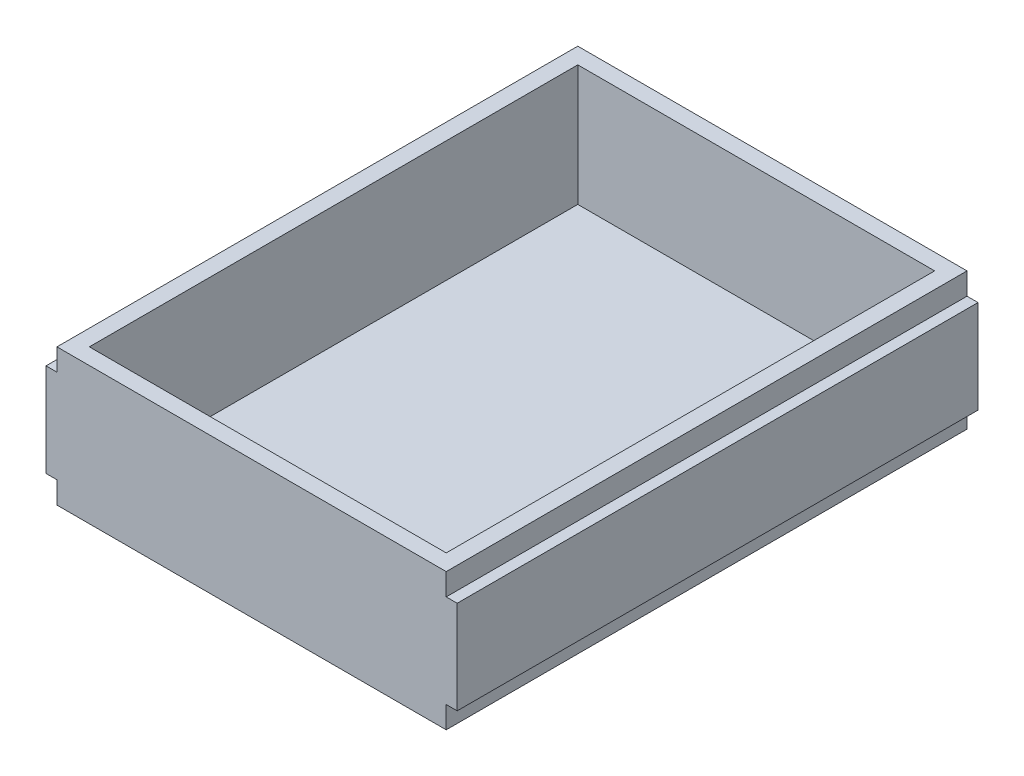
ISO-10303-21;
HEADER;
FILE_DESCRIPTION(('STEP AP214'),'2;1');
FILE_NAME('part.step','',(''),(''),'','','');
FILE_SCHEMA(('AUTOMOTIVE_DESIGN { 1 0 10303 214 1 1 1 1 }'));
ENDSEC;
DATA;
#1=APPLICATION_CONTEXT('core data for automotive mechanical design processes');
#2=APPLICATION_PROTOCOL_DEFINITION('international standard','automotive_design',2000,#1);
#3=PRODUCT_CONTEXT('',#1,'mechanical');
#4=PRODUCT('Part','Part','',(#3));
#5=PRODUCT_RELATED_PRODUCT_CATEGORY('part','',(#4));
#6=PRODUCT_DEFINITION_FORMATION('','',#4);
#7=PRODUCT_DEFINITION_CONTEXT('part definition',#1,'design');
#8=PRODUCT_DEFINITION('design','',#6,#7);
#9=PRODUCT_DEFINITION_SHAPE('','',#8);
#10=(LENGTH_UNIT() NAMED_UNIT(*) SI_UNIT(.MILLI.,.METRE.));
#11=(NAMED_UNIT(*) PLANE_ANGLE_UNIT() SI_UNIT($,.RADIAN.));
#12=(NAMED_UNIT(*) SI_UNIT($,.STERADIAN.) SOLID_ANGLE_UNIT());
#13=UNCERTAINTY_MEASURE_WITH_UNIT(LENGTH_MEASURE(1.E-05),#10,'distance_accuracy_value','');
#14=(GEOMETRIC_REPRESENTATION_CONTEXT(3) GLOBAL_UNCERTAINTY_ASSIGNED_CONTEXT((#13)) GLOBAL_UNIT_ASSIGNED_CONTEXT((#10,
#11,#12)) REPRESENTATION_CONTEXT('',''));
#15=CARTESIAN_POINT('',(0.,0.,0.));
#16=DIRECTION('',(0.,0.,1.));
#17=DIRECTION('',(1.,0.,0.));
#18=AXIS2_PLACEMENT_3D('',#15,#16,#17);
#19=CARTESIAN_POINT('',(0.,0.,0.));
#20=DIRECTION('',(0.,0.,1.));
#21=DIRECTION('',(1.,0.,0.));
#22=AXIS2_PLACEMENT_3D('',#19,#20,#21);
#23=PLANE('',#22);
#24=DIRECTION('',(0.,1.,0.));
#25=VECTOR('',#24,1.);
#26=CARTESIAN_POINT('',(0.,0.,0.));
#27=LINE('',#26,#25);
#28=CARTESIAN_POINT('',(0.,0.,0.));
#29=VERTEX_POINT('',#28);
#30=CARTESIAN_POINT('',(0.,4.06399999999999,0.));
#31=VERTEX_POINT('',#30);
#32=EDGE_CURVE('E345',#29,#31,#27,.T.);
#33=ORIENTED_EDGE('',*,*,#32,.F.);
#34=DIRECTION('',(1.,0.,0.));
#35=VECTOR('',#34,1.);
#36=CARTESIAN_POINT('',(0.,0.,0.));
#37=LINE('',#36,#35);
#38=CARTESIAN_POINT('',(-72.136,0.,0.));
#39=VERTEX_POINT('',#38);
#40=EDGE_CURVE('E357',#39,#29,#37,.T.);
#41=ORIENTED_EDGE('',*,*,#40,.F.);
#42=DIRECTION('',(0.,-1.,0.));
#43=VECTOR('',#42,1.);
#44=CARTESIAN_POINT('',(-72.136,0.,0.));
#45=LINE('',#44,#43);
#46=CARTESIAN_POINT('',(-72.136,4.064,0.));
#47=VERTEX_POINT('',#46);
#48=EDGE_CURVE('E352',#47,#39,#45,.T.);
#49=ORIENTED_EDGE('',*,*,#48,.F.);
#50=DIRECTION('',(-1.,0.,0.));
#51=VECTOR('',#50,1.);
#52=CARTESIAN_POINT('',(-74.168,4.064,0.));
#53=LINE('',#52,#51);
#54=CARTESIAN_POINT('',(-74.168,4.064,0.));
#55=VERTEX_POINT('',#54);
#56=EDGE_CURVE('E266',#47,#55,#53,.T.);
#57=ORIENTED_EDGE('',*,*,#56,.T.);
#58=DIRECTION('',(0.,1.,0.));
#59=VECTOR('',#58,1.);
#60=CARTESIAN_POINT('',(-74.168,21.336,0.));
#61=LINE('',#60,#59);
#62=CARTESIAN_POINT('',(-74.168,21.336,0.));
#63=VERTEX_POINT('',#62);
#64=EDGE_CURVE('E236',#55,#63,#61,.T.);
#65=ORIENTED_EDGE('',*,*,#64,.T.);
#66=DIRECTION('',(1.,0.,0.));
#67=VECTOR('',#66,1.);
#68=CARTESIAN_POINT('',(-72.136,21.336,0.));
#69=LINE('',#68,#67);
#70=CARTESIAN_POINT('',(-72.136,21.336,0.));
#71=VERTEX_POINT('',#70);
#72=EDGE_CURVE('E270',#63,#71,#69,.T.);
#73=ORIENTED_EDGE('',*,*,#72,.T.);
#74=CARTESIAN_POINT('',(-72.136,25.4,0.));
#75=VERTEX_POINT('',#74);
#76=EDGE_CURVE('E353',#75,#71,#45,.T.);
#77=ORIENTED_EDGE('',*,*,#76,.F.);
#78=DIRECTION('',(-1.,0.,0.));
#79=VECTOR('',#78,1.);
#80=CARTESIAN_POINT('',(0.,25.4,0.));
#81=LINE('',#80,#79);
#82=CARTESIAN_POINT('',(0.,25.4,0.));
#83=VERTEX_POINT('',#82);
#84=EDGE_CURVE('E349',#83,#75,#81,.T.);
#85=ORIENTED_EDGE('',*,*,#84,.F.);
#86=CARTESIAN_POINT('',(0.,21.336,0.));
#87=VERTEX_POINT('',#86);
#88=EDGE_CURVE('E319',#87,#83,#27,.T.);
#89=ORIENTED_EDGE('',*,*,#88,.F.);
#90=DIRECTION('',(1.,0.,0.));
#91=VECTOR('',#90,1.);
#92=CARTESIAN_POINT('',(0.,21.336,0.));
#93=LINE('',#92,#91);
#94=CARTESIAN_POINT('',(2.032,21.336,0.));
#95=VERTEX_POINT('',#94);
#96=EDGE_CURVE('E231',#87,#95,#93,.T.);
#97=ORIENTED_EDGE('',*,*,#96,.T.);
#98=DIRECTION('',(0.,-1.,0.));
#99=VECTOR('',#98,1.);
#100=CARTESIAN_POINT('',(2.032,21.336,0.));
#101=LINE('',#100,#99);
#102=CARTESIAN_POINT('',(2.032,4.06399999999999,0.));
#103=VERTEX_POINT('',#102);
#104=EDGE_CURVE('E235',#95,#103,#101,.T.);
#105=ORIENTED_EDGE('',*,*,#104,.T.);
#106=DIRECTION('',(-1.,0.,0.));
#107=VECTOR('',#106,1.);
#108=CARTESIAN_POINT('',(2.032,4.06399999999999,0.));
#109=LINE('',#108,#107);
#110=EDGE_CURVE('E223',#103,#31,#109,.T.);
#111=ORIENTED_EDGE('',*,*,#110,.T.);
#112=EDGE_LOOP('',(#33,#41,#49,#57,#65,#73,#77,#85,#89,#97,#105,#111));
#113=FACE_BOUND('',#112,.T.);
#114=DIRECTION('',(0.,-1.,0.));
#115=VECTOR('',#114,1.);
#116=CARTESIAN_POINT('',(-27.818,1.262624701943,0.));
#117=LINE('',#116,#115);
#118=CARTESIAN_POINT('',(-27.818,5.262624701943,0.));
#119=VERTEX_POINT('',#118);
#120=CARTESIAN_POINT('',(-27.818,1.262624701943,0.));
#121=VERTEX_POINT('',#120);
#122=EDGE_CURVE('E63',#119,#121,#117,.T.);
#123=ORIENTED_EDGE('',*,*,#122,.F.);
#124=DIRECTION('',(1.,0.,0.));
#125=VECTOR('',#124,1.);
#126=CARTESIAN_POINT('',(-44.318,5.262624701943,0.));
#127=LINE('',#126,#125);
#128=CARTESIAN_POINT('',(-44.318,5.262624701943,0.));
#129=VERTEX_POINT('',#128);
#130=EDGE_CURVE('E67',#129,#119,#127,.T.);
#131=ORIENTED_EDGE('',*,*,#130,.F.);
#132=DIRECTION('',(0.,1.,0.));
#133=VECTOR('',#132,1.);
#134=CARTESIAN_POINT('',(-44.318,1.262624701943,0.));
#135=LINE('',#134,#133);
#136=CARTESIAN_POINT('',(-44.318,1.262624701943,0.));
#137=VERTEX_POINT('',#136);
#138=EDGE_CURVE('E584',#137,#129,#135,.T.);
#139=ORIENTED_EDGE('',*,*,#138,.F.);
#140=DIRECTION('',(-1.,0.,0.));
#141=VECTOR('',#140,1.);
#142=CARTESIAN_POINT('',(-44.318,1.262624701943,0.));
#143=LINE('',#142,#141);
#144=EDGE_CURVE('E594',#121,#137,#143,.T.);
#145=ORIENTED_EDGE('',*,*,#144,.F.);
#146=EDGE_LOOP('',(#123,#131,#139,#145));
#147=FACE_BOUND('',#146,.T.);
#148=ADVANCED_FACE('F47',(#113,#147),#23,.F.);
#149=CARTESIAN_POINT('',(0.,0.,96.52));
#150=DIRECTION('',(-1.,0.,0.));
#151=DIRECTION('',(0.,-1.,0.));
#152=AXIS2_PLACEMENT_3D('',#149,#150,#151);
#153=PLANE('',#152);
#154=DIRECTION('',(0.,0.,-1.));
#155=VECTOR('',#154,1.);
#156=CARTESIAN_POINT('',(0.,4.06399999999999,96.52));
#157=LINE('',#156,#155);
#158=CARTESIAN_POINT('',(0.,4.06399999999999,96.52));
#159=VERTEX_POINT('',#158);
#160=EDGE_CURVE('E243',#159,#31,#157,.T.);
#161=ORIENTED_EDGE('',*,*,#160,.F.);
#162=DIRECTION('',(0.,1.,0.));
#163=VECTOR('',#162,1.);
#164=CARTESIAN_POINT('',(0.,0.,96.52));
#165=LINE('',#164,#163);
#166=CARTESIAN_POINT('',(0.,0.,96.52));
#167=VERTEX_POINT('',#166);
#168=EDGE_CURVE('E328',#167,#159,#165,.T.);
#169=ORIENTED_EDGE('',*,*,#168,.F.);
#170=DIRECTION('',(0.,0.,-1.));
#171=VECTOR('',#170,1.);
#172=CARTESIAN_POINT('',(0.,0.,96.52));
#173=LINE('',#172,#171);
#174=EDGE_CURVE('E344',#167,#29,#173,.T.);
#175=ORIENTED_EDGE('',*,*,#174,.T.);
#176=ORIENTED_EDGE('',*,*,#32,.T.);
#177=EDGE_LOOP('',(#161,#169,#175,#176));
#178=FACE_BOUND('',#177,.T.);
#179=ADVANCED_FACE('F412',(#178),#153,.F.);
#180=CARTESIAN_POINT('',(-72.136,0.,96.52));
#181=DIRECTION('',(1.,0.,0.));
#182=DIRECTION('',(0.,0.,-1.));
#183=AXIS2_PLACEMENT_3D('',#180,#181,#182);
#184=PLANE('',#183);
#185=DIRECTION('',(0.,0.,-1.));
#186=VECTOR('',#185,1.);
#187=CARTESIAN_POINT('',(-72.136,21.336,96.52));
#188=LINE('',#187,#186);
#189=CARTESIAN_POINT('',(-72.136,21.336,96.52));
#190=VERTEX_POINT('',#189);
#191=EDGE_CURVE('E260',#190,#71,#188,.T.);
#192=ORIENTED_EDGE('',*,*,#191,.F.);
#193=DIRECTION('',(0.,-1.,0.));
#194=VECTOR('',#193,1.);
#195=CARTESIAN_POINT('',(-72.136,0.,96.52));
#196=LINE('',#195,#194);
#197=CARTESIAN_POINT('',(-72.136,25.4,96.52));
#198=VERTEX_POINT('',#197);
#199=EDGE_CURVE('E337',#198,#190,#196,.T.);
#200=ORIENTED_EDGE('',*,*,#199,.F.);
#201=DIRECTION('',(0.,0.,-1.));
#202=VECTOR('',#201,1.);
#203=CARTESIAN_POINT('',(-72.136,25.4,96.52));
#204=LINE('',#203,#202);
#205=EDGE_CURVE('E56',#198,#75,#204,.T.);
#206=ORIENTED_EDGE('',*,*,#205,.T.);
#207=ORIENTED_EDGE('',*,*,#76,.T.);
#208=EDGE_LOOP('',(#192,#200,#206,#207));
#209=FACE_BOUND('',#208,.T.);
#210=ADVANCED_FACE('F373',(#209),#184,.F.);
#211=CARTESIAN_POINT('',(0.,25.4,96.52));
#212=DIRECTION('',(0.,-1.,0.));
#213=DIRECTION('',(1.,0.,0.));
#214=AXIS2_PLACEMENT_3D('',#211,#212,#213);
#215=PLANE('',#214);
#216=ORIENTED_EDGE('',*,*,#84,.T.);
#217=ORIENTED_EDGE('',*,*,#205,.F.);
#218=DIRECTION('',(-1.,0.,0.));
#219=VECTOR('',#218,1.);
#220=CARTESIAN_POINT('',(0.,25.4,96.52));
#221=LINE('',#220,#219);
#222=CARTESIAN_POINT('',(0.,25.4,96.52));
#223=VERTEX_POINT('',#222);
#224=EDGE_CURVE('E332',#223,#198,#221,.T.);
#225=ORIENTED_EDGE('',*,*,#224,.F.);
#226=DIRECTION('',(0.,0.,-1.));
#227=VECTOR('',#226,1.);
#228=CARTESIAN_POINT('',(0.,25.4,96.52));
#229=LINE('',#228,#227);
#230=EDGE_CURVE('E11',#223,#83,#229,.T.);
#231=ORIENTED_EDGE('',*,*,#230,.T.);
#232=EDGE_LOOP('',(#216,#217,#225,#231));
#233=FACE_BOUND('',#232,.T.);
#234=DIRECTION('',(-1.,0.,0.));
#235=VECTOR('',#234,1.);
#236=CARTESIAN_POINT('',(0.,25.4,3.));
#237=LINE('',#236,#235);
#238=CARTESIAN_POINT('',(-3.,25.4,3.));
#239=VERTEX_POINT('',#238);
#240=CARTESIAN_POINT('',(-69.136,25.4,3.));
#241=VERTEX_POINT('',#240);
#242=EDGE_CURVE('E290',#239,#241,#237,.T.);
#243=ORIENTED_EDGE('',*,*,#242,.F.);
#244=DIRECTION('',(0.,0.,-1.));
#245=VECTOR('',#244,1.);
#246=CARTESIAN_POINT('',(-3.,25.4,96.52));
#247=LINE('',#246,#245);
#248=CARTESIAN_POINT('',(-3.,25.4,93.52));
#249=VERTEX_POINT('',#248);
#250=EDGE_CURVE('E316',#249,#239,#247,.T.);
#251=ORIENTED_EDGE('',*,*,#250,.F.);
#252=DIRECTION('',(-1.,0.,0.));
#253=VECTOR('',#252,1.);
#254=CARTESIAN_POINT('',(0.,25.4,93.52));
#255=LINE('',#254,#253);
#256=CARTESIAN_POINT('',(-69.136,25.4,93.52));
#257=VERTEX_POINT('',#256);
#258=EDGE_CURVE('E294',#249,#257,#255,.T.);
#259=ORIENTED_EDGE('',*,*,#258,.T.);
#260=DIRECTION('',(0.,0.,-1.));
#261=VECTOR('',#260,1.);
#262=CARTESIAN_POINT('',(-69.136,25.4,96.52));
#263=LINE('',#262,#261);
#264=EDGE_CURVE('E311',#257,#241,#263,.T.);
#265=ORIENTED_EDGE('',*,*,#264,.T.);
#266=EDGE_LOOP('',(#243,#251,#259,#265));
#267=FACE_BOUND('',#266,.T.);
#268=ADVANCED_FACE('F391',(#233,#267),#215,.F.);
#269=CARTESIAN_POINT('',(0.,21.336,96.52));
#270=VERTEX_POINT('',#269);
#271=EDGE_CURVE('E333',#270,#223,#165,.T.);
#272=ORIENTED_EDGE('',*,*,#271,.F.);
#273=DIRECTION('',(0.,0.,-1.));
#274=VECTOR('',#273,1.);
#275=CARTESIAN_POINT('',(0.,21.336,96.52));
#276=LINE('',#275,#274);
#277=EDGE_CURVE('E230',#270,#87,#276,.T.);
#278=ORIENTED_EDGE('',*,*,#277,.T.);
#279=ORIENTED_EDGE('',*,*,#88,.T.);
#280=ORIENTED_EDGE('',*,*,#230,.F.);
#281=EDGE_LOOP('',(#272,#278,#279,#280));
#282=FACE_BOUND('',#281,.T.);
#283=ADVANCED_FACE('F49',(#282),#153,.F.);
#284=CARTESIAN_POINT('',(-72.136,4.064,96.52));
#285=VERTEX_POINT('',#284);
#286=CARTESIAN_POINT('',(-72.136,0.,96.52));
#287=VERTEX_POINT('',#286);
#288=EDGE_CURVE('E336',#285,#287,#196,.T.);
#289=ORIENTED_EDGE('',*,*,#288,.F.);
#290=DIRECTION('',(0.,0.,-1.));
#291=VECTOR('',#290,1.);
#292=CARTESIAN_POINT('',(-72.136,4.064,96.52));
#293=LINE('',#292,#291);
#294=EDGE_CURVE('E212',#285,#47,#293,.T.);
#295=ORIENTED_EDGE('',*,*,#294,.T.);
#296=ORIENTED_EDGE('',*,*,#48,.T.);
#297=DIRECTION('',(0.,0.,-1.));
#298=VECTOR('',#297,1.);
#299=CARTESIAN_POINT('',(-72.136,0.,96.52));
#300=LINE('',#299,#298);
#301=EDGE_CURVE('E363',#287,#39,#300,.T.);
#302=ORIENTED_EDGE('',*,*,#301,.F.);
#303=EDGE_LOOP('',(#289,#295,#296,#302));
#304=FACE_BOUND('',#303,.T.);
#305=ADVANCED_FACE('F404',(#304),#184,.F.);
#306=CARTESIAN_POINT('',(0.,0.,96.52));
#307=DIRECTION('',(0.,1.,0.));
#308=DIRECTION('',(0.,0.,1.));
#309=AXIS2_PLACEMENT_3D('',#306,#307,#308);
#310=PLANE('',#309);
#311=ORIENTED_EDGE('',*,*,#40,.T.);
#312=ORIENTED_EDGE('',*,*,#174,.F.);
#313=DIRECTION('',(1.,0.,0.));
#314=VECTOR('',#313,1.);
#315=CARTESIAN_POINT('',(0.,0.,96.52));
#316=LINE('',#315,#314);
#317=EDGE_CURVE('E341',#287,#167,#316,.T.);
#318=ORIENTED_EDGE('',*,*,#317,.F.);
#319=ORIENTED_EDGE('',*,*,#301,.T.);
#320=EDGE_LOOP('',(#311,#312,#318,#319));
#321=FACE_BOUND('',#320,.T.);
#322=ADVANCED_FACE('F408',(#321),#310,.F.);
#323=CARTESIAN_POINT('',(0.,0.,96.52));
#324=DIRECTION('',(0.,0.,1.));
#325=DIRECTION('',(1.,0.,0.));
#326=AXIS2_PLACEMENT_3D('',#323,#324,#325);
#327=PLANE('',#326);
#328=ORIENTED_EDGE('',*,*,#168,.T.);
#329=DIRECTION('',(-1.,0.,0.));
#330=VECTOR('',#329,1.);
#331=CARTESIAN_POINT('',(2.032,4.06399999999999,96.52));
#332=LINE('',#331,#330);
#333=CARTESIAN_POINT('',(2.032,4.06399999999999,96.52));
#334=VERTEX_POINT('',#333);
#335=EDGE_CURVE('E227',#334,#159,#332,.T.);
#336=ORIENTED_EDGE('',*,*,#335,.F.);
#337=DIRECTION('',(0.,-1.,0.));
#338=VECTOR('',#337,1.);
#339=CARTESIAN_POINT('',(2.032,21.336,96.52));
#340=LINE('',#339,#338);
#341=CARTESIAN_POINT('',(2.032,21.336,96.52));
#342=VERTEX_POINT('',#341);
#343=EDGE_CURVE('E222',#342,#334,#340,.T.);
#344=ORIENTED_EDGE('',*,*,#343,.F.);
#345=DIRECTION('',(1.,0.,0.));
#346=VECTOR('',#345,1.);
#347=CARTESIAN_POINT('',(0.,21.336,96.52));
#348=LINE('',#347,#346);
#349=EDGE_CURVE('E218',#270,#342,#348,.T.);
#350=ORIENTED_EDGE('',*,*,#349,.F.);
#351=ORIENTED_EDGE('',*,*,#271,.T.);
#352=ORIENTED_EDGE('',*,*,#224,.T.);
#353=ORIENTED_EDGE('',*,*,#199,.T.);
#354=DIRECTION('',(1.,0.,0.));
#355=VECTOR('',#354,1.);
#356=CARTESIAN_POINT('',(-72.136,21.336,96.52));
#357=LINE('',#356,#355);
#358=CARTESIAN_POINT('',(-74.168,21.336,96.52));
#359=VERTEX_POINT('',#358);
#360=EDGE_CURVE('E281',#359,#190,#357,.T.);
#361=ORIENTED_EDGE('',*,*,#360,.F.);
#362=DIRECTION('',(0.,1.,0.));
#363=VECTOR('',#362,1.);
#364=CARTESIAN_POINT('',(-74.168,21.336,96.52));
#365=LINE('',#364,#363);
#366=CARTESIAN_POINT('',(-74.168,4.064,96.52));
#367=VERTEX_POINT('',#366);
#368=EDGE_CURVE('E271',#367,#359,#365,.T.);
#369=ORIENTED_EDGE('',*,*,#368,.F.);
#370=DIRECTION('',(-1.,0.,0.));
#371=VECTOR('',#370,1.);
#372=CARTESIAN_POINT('',(-74.168,4.064,96.52));
#373=LINE('',#372,#371);
#374=EDGE_CURVE('E259',#285,#367,#373,.T.);
#375=ORIENTED_EDGE('',*,*,#374,.F.);
#376=ORIENTED_EDGE('',*,*,#288,.T.);
#377=ORIENTED_EDGE('',*,*,#317,.T.);
#378=EDGE_LOOP('',(#328,#336,#344,#350,#351,#352,#353,#361,#369,#375,#376,#377));
#379=FACE_BOUND('',#378,.T.);
#380=ADVANCED_FACE('F386',(#379),#327,.T.);
#381=CARTESIAN_POINT('',(-3.,0.,96.52));
#382=DIRECTION('',(-1.,0.,0.));
#383=DIRECTION('',(0.,-1.,0.));
#384=AXIS2_PLACEMENT_3D('',#381,#382,#383);
#385=PLANE('',#384);
#386=DIRECTION('',(0.,1.,0.));
#387=VECTOR('',#386,1.);
#388=CARTESIAN_POINT('',(-3.,0.,3.));
#389=LINE('',#388,#387);
#390=CARTESIAN_POINT('',(-3.,3.,3.));
#391=VERTEX_POINT('',#390);
#392=EDGE_CURVE('E246',#391,#239,#389,.T.);
#393=ORIENTED_EDGE('',*,*,#392,.F.);
#394=DIRECTION('',(0.,0.,-1.));
#395=VECTOR('',#394,1.);
#396=CARTESIAN_POINT('',(-3.,3.,96.52));
#397=LINE('',#396,#395);
#398=CARTESIAN_POINT('',(-3.,3.,93.52));
#399=VERTEX_POINT('',#398);
#400=EDGE_CURVE('E296',#399,#391,#397,.T.);
#401=ORIENTED_EDGE('',*,*,#400,.F.);
#402=DIRECTION('',(0.,1.,0.));
#403=VECTOR('',#402,1.);
#404=CARTESIAN_POINT('',(-3.,0.,93.52));
#405=LINE('',#404,#403);
#406=EDGE_CURVE('E291',#399,#249,#405,.T.);
#407=ORIENTED_EDGE('',*,*,#406,.T.);
#408=ORIENTED_EDGE('',*,*,#250,.T.);
#409=EDGE_LOOP('',(#393,#401,#407,#408));
#410=FACE_BOUND('',#409,.T.);
#411=ADVANCED_FACE('F480',(#410),#385,.T.);
#412=CARTESIAN_POINT('',(-69.136,0.,96.52));
#413=DIRECTION('',(1.,0.,0.));
#414=DIRECTION('',(0.,0.,-1.));
#415=AXIS2_PLACEMENT_3D('',#412,#413,#414);
#416=PLANE('',#415);
#417=DIRECTION('',(0.,-1.,0.));
#418=VECTOR('',#417,1.);
#419=CARTESIAN_POINT('',(-69.136,0.,3.));
#420=LINE('',#419,#418);
#421=CARTESIAN_POINT('',(-69.136,3.,3.));
#422=VERTEX_POINT('',#421);
#423=EDGE_CURVE('E304',#241,#422,#420,.T.);
#424=ORIENTED_EDGE('',*,*,#423,.F.);
#425=ORIENTED_EDGE('',*,*,#264,.F.);
#426=DIRECTION('',(0.,-1.,0.));
#427=VECTOR('',#426,1.);
#428=CARTESIAN_POINT('',(-69.136,0.,93.52));
#429=LINE('',#428,#427);
#430=CARTESIAN_POINT('',(-69.136,3.,93.52));
#431=VERTEX_POINT('',#430);
#432=EDGE_CURVE('E307',#257,#431,#429,.T.);
#433=ORIENTED_EDGE('',*,*,#432,.T.);
#434=DIRECTION('',(0.,0.,-1.));
#435=VECTOR('',#434,1.);
#436=CARTESIAN_POINT('',(-69.136,3.,96.52));
#437=LINE('',#436,#435);
#438=EDGE_CURVE('E300',#431,#422,#437,.T.);
#439=ORIENTED_EDGE('',*,*,#438,.T.);
#440=EDGE_LOOP('',(#424,#425,#433,#439));
#441=FACE_BOUND('',#440,.T.);
#442=ADVANCED_FACE('F602',(#441),#416,.T.);
#443=CARTESIAN_POINT('',(0.,3.,96.52));
#444=DIRECTION('',(0.,1.,0.));
#445=DIRECTION('',(0.,0.,1.));
#446=AXIS2_PLACEMENT_3D('',#443,#444,#445);
#447=PLANE('',#446);
#448=DIRECTION('',(1.,0.,0.));
#449=VECTOR('',#448,1.);
#450=CARTESIAN_POINT('',(0.,3.,3.));
#451=LINE('',#450,#449);
#452=EDGE_CURVE('E295',#422,#391,#451,.T.);
#453=ORIENTED_EDGE('',*,*,#452,.F.);
#454=ORIENTED_EDGE('',*,*,#438,.F.);
#455=DIRECTION('',(1.,0.,0.));
#456=VECTOR('',#455,1.);
#457=CARTESIAN_POINT('',(0.,3.,93.52));
#458=LINE('',#457,#456);
#459=EDGE_CURVE('E301',#431,#399,#458,.T.);
#460=ORIENTED_EDGE('',*,*,#459,.T.);
#461=ORIENTED_EDGE('',*,*,#400,.T.);
#462=EDGE_LOOP('',(#453,#454,#460,#461));
#463=FACE_BOUND('',#462,.T.);
#464=ADVANCED_FACE('F606',(#463),#447,.T.);
#465=CARTESIAN_POINT('',(0.,0.,93.52));
#466=DIRECTION('',(0.,0.,1.));
#467=DIRECTION('',(1.,0.,0.));
#468=AXIS2_PLACEMENT_3D('',#465,#466,#467);
#469=PLANE('',#468);
#470=ORIENTED_EDGE('',*,*,#406,.F.);
#471=ORIENTED_EDGE('',*,*,#459,.F.);
#472=ORIENTED_EDGE('',*,*,#432,.F.);
#473=ORIENTED_EDGE('',*,*,#258,.F.);
#474=EDGE_LOOP('',(#470,#471,#472,#473));
#475=FACE_BOUND('',#474,.T.);
#476=ADVANCED_FACE('F436',(#475),#469,.F.);
#477=CARTESIAN_POINT('',(0.,0.,3.));
#478=DIRECTION('',(0.,0.,1.));
#479=DIRECTION('',(1.,0.,0.));
#480=AXIS2_PLACEMENT_3D('',#477,#478,#479);
#481=PLANE('',#480);
#482=ORIENTED_EDGE('',*,*,#392,.T.);
#483=ORIENTED_EDGE('',*,*,#242,.T.);
#484=ORIENTED_EDGE('',*,*,#423,.T.);
#485=ORIENTED_EDGE('',*,*,#452,.T.);
#486=EDGE_LOOP('',(#482,#483,#484,#485));
#487=FACE_BOUND('',#486,.T.);
#488=ADVANCED_FACE('F428',(#487),#481,.T.);
#489=CARTESIAN_POINT('',(-74.168,21.336,96.52));
#490=DIRECTION('',(-1.,0.,0.));
#491=DIRECTION('',(0.,-1.,0.));
#492=AXIS2_PLACEMENT_3D('',#489,#490,#491);
#493=PLANE('',#492);
#494=ORIENTED_EDGE('',*,*,#64,.F.);
#495=DIRECTION('',(0.,0.,-1.));
#496=VECTOR('',#495,1.);
#497=CARTESIAN_POINT('',(-74.168,4.064,96.52));
#498=LINE('',#497,#496);
#499=EDGE_CURVE('E208',#367,#55,#498,.T.);
#500=ORIENTED_EDGE('',*,*,#499,.F.);
#501=ORIENTED_EDGE('',*,*,#368,.T.);
#502=DIRECTION('',(0.,0.,-1.));
#503=VECTOR('',#502,1.);
#504=CARTESIAN_POINT('',(-74.168,21.336,96.52));
#505=LINE('',#504,#503);
#506=EDGE_CURVE('E256',#359,#63,#505,.T.);
#507=ORIENTED_EDGE('',*,*,#506,.T.);
#508=EDGE_LOOP('',(#494,#500,#501,#507));
#509=FACE_BOUND('',#508,.T.);
#510=ADVANCED_FACE('F426',(#509),#493,.T.);
#511=CARTESIAN_POINT('',(-74.168,4.064,96.52));
#512=DIRECTION('',(0.,-1.,0.));
#513=DIRECTION('',(1.,0.,0.));
#514=AXIS2_PLACEMENT_3D('',#511,#512,#513);
#515=PLANE('',#514);
#516=ORIENTED_EDGE('',*,*,#56,.F.);
#517=ORIENTED_EDGE('',*,*,#294,.F.);
#518=ORIENTED_EDGE('',*,*,#374,.T.);
#519=ORIENTED_EDGE('',*,*,#499,.T.);
#520=EDGE_LOOP('',(#516,#517,#518,#519));
#521=FACE_BOUND('',#520,.T.);
#522=ADVANCED_FACE('F424',(#521),#515,.T.);
#523=CARTESIAN_POINT('',(-72.136,21.336,96.52));
#524=DIRECTION('',(0.,1.,0.));
#525=DIRECTION('',(-1.,0.,0.));
#526=AXIS2_PLACEMENT_3D('',#523,#524,#525);
#527=PLANE('',#526);
#528=ORIENTED_EDGE('',*,*,#72,.F.);
#529=ORIENTED_EDGE('',*,*,#506,.F.);
#530=ORIENTED_EDGE('',*,*,#360,.T.);
#531=ORIENTED_EDGE('',*,*,#191,.T.);
#532=EDGE_LOOP('',(#528,#529,#530,#531));
#533=FACE_BOUND('',#532,.T.);
#534=ADVANCED_FACE('F383',(#533),#527,.T.);
#535=CARTESIAN_POINT('',(2.032,4.06399999999999,96.52));
#536=DIRECTION('',(0.,-1.,0.));
#537=DIRECTION('',(1.,0.,0.));
#538=AXIS2_PLACEMENT_3D('',#535,#536,#537);
#539=PLANE('',#538);
#540=ORIENTED_EDGE('',*,*,#110,.F.);
#541=DIRECTION('',(0.,0.,-1.));
#542=VECTOR('',#541,1.);
#543=CARTESIAN_POINT('',(2.032,4.06399999999999,96.52));
#544=LINE('',#543,#542);
#545=EDGE_CURVE('E247',#334,#103,#544,.T.);
#546=ORIENTED_EDGE('',*,*,#545,.F.);
#547=ORIENTED_EDGE('',*,*,#335,.T.);
#548=ORIENTED_EDGE('',*,*,#160,.T.);
#549=EDGE_LOOP('',(#540,#546,#547,#548));
#550=FACE_BOUND('',#549,.T.);
#551=ADVANCED_FACE('F417',(#550),#539,.T.);
#552=CARTESIAN_POINT('',(2.032,21.336,96.52));
#553=DIRECTION('',(1.,0.,0.));
#554=DIRECTION('',(0.,1.,0.));
#555=AXIS2_PLACEMENT_3D('',#552,#553,#554);
#556=PLANE('',#555);
#557=ORIENTED_EDGE('',*,*,#104,.F.);
#558=DIRECTION('',(0.,0.,-1.));
#559=VECTOR('',#558,1.);
#560=CARTESIAN_POINT('',(2.032,21.336,96.52));
#561=LINE('',#560,#559);
#562=EDGE_CURVE('E250',#342,#95,#561,.T.);
#563=ORIENTED_EDGE('',*,*,#562,.F.);
#564=ORIENTED_EDGE('',*,*,#343,.T.);
#565=ORIENTED_EDGE('',*,*,#545,.T.);
#566=EDGE_LOOP('',(#557,#563,#564,#565));
#567=FACE_BOUND('',#566,.T.);
#568=ADVANCED_FACE('F420',(#567),#556,.T.);
#569=CARTESIAN_POINT('',(0.,21.336,96.52));
#570=DIRECTION('',(0.,1.,0.));
#571=DIRECTION('',(-1.,0.,0.));
#572=AXIS2_PLACEMENT_3D('',#569,#570,#571);
#573=PLANE('',#572);
#574=ORIENTED_EDGE('',*,*,#96,.F.);
#575=ORIENTED_EDGE('',*,*,#277,.F.);
#576=ORIENTED_EDGE('',*,*,#349,.T.);
#577=ORIENTED_EDGE('',*,*,#562,.T.);
#578=EDGE_LOOP('',(#574,#575,#576,#577));
#579=FACE_BOUND('',#578,.T.);
#580=ADVANCED_FACE('F422',(#579),#573,.T.);
#581=CARTESIAN_POINT('',(-27.818,1.262624701943,-4.5));
#582=DIRECTION('',(-1.,0.,0.));
#583=DIRECTION('',(0.,0.,1.));
#584=AXIS2_PLACEMENT_3D('',#581,#582,#583);
#585=PLANE('',#584);
#586=ORIENTED_EDGE('',*,*,#122,.T.);
#587=DIRECTION('',(0.,0.,1.));
#588=VECTOR('',#587,1.);
#589=CARTESIAN_POINT('',(-27.818,1.262624701943,-4.5));
#590=LINE('',#589,#588);
#591=CARTESIAN_POINT('',(-27.818,1.262624701943,-4.5));
#592=VERTEX_POINT('',#591);
#593=EDGE_CURVE('E188',#592,#121,#590,.T.);
#594=ORIENTED_EDGE('',*,*,#593,.F.);
#595=DIRECTION('',(0.,-1.,0.));
#596=VECTOR('',#595,1.);
#597=CARTESIAN_POINT('',(-27.818,1.262624701943,-4.5));
#598=LINE('',#597,#596);
#599=CARTESIAN_POINT('',(-27.818,5.262624701943,-4.5));
#600=VERTEX_POINT('',#599);
#601=EDGE_CURVE('E195',#600,#592,#598,.T.);
#602=ORIENTED_EDGE('',*,*,#601,.F.);
#603=DIRECTION('',(0.,0.,1.));
#604=VECTOR('',#603,1.);
#605=CARTESIAN_POINT('',(-27.818,5.262624701943,-4.5));
#606=LINE('',#605,#604);
#607=EDGE_CURVE('E581',#600,#119,#606,.T.);
#608=ORIENTED_EDGE('',*,*,#607,.T.);
#609=EDGE_LOOP('',(#586,#594,#602,#608));
#610=FACE_BOUND('',#609,.T.);
#611=ADVANCED_FACE('F206',(#610),#585,.F.);
#612=CARTESIAN_POINT('',(-44.318,1.262624701943,-4.5));
#613=DIRECTION('',(0.,1.,0.));
#614=DIRECTION('',(-1.,0.,0.));
#615=AXIS2_PLACEMENT_3D('',#612,#613,#614);
#616=PLANE('',#615);
#617=ORIENTED_EDGE('',*,*,#144,.T.);
#618=DIRECTION('',(0.,0.,1.));
#619=VECTOR('',#618,1.);
#620=CARTESIAN_POINT('',(-44.318,1.262624701943,-4.5));
#621=LINE('',#620,#619);
#622=CARTESIAN_POINT('',(-44.318,1.262624701943,-4.5));
#623=VERTEX_POINT('',#622);
#624=EDGE_CURVE('E190',#623,#137,#621,.T.);
#625=ORIENTED_EDGE('',*,*,#624,.F.);
#626=DIRECTION('',(-1.,0.,0.));
#627=VECTOR('',#626,1.);
#628=CARTESIAN_POINT('',(-44.318,1.262624701943,-4.5));
#629=LINE('',#628,#627);
#630=EDGE_CURVE('E183',#592,#623,#629,.T.);
#631=ORIENTED_EDGE('',*,*,#630,.F.);
#632=ORIENTED_EDGE('',*,*,#593,.T.);
#633=EDGE_LOOP('',(#617,#625,#631,#632));
#634=FACE_BOUND('',#633,.T.);
#635=ADVANCED_FACE('F186',(#634),#616,.F.);
#636=CARTESIAN_POINT('',(-44.318,1.262624701943,-4.5));
#637=DIRECTION('',(1.,0.,0.));
#638=DIRECTION('',(0.,0.,-1.));
#639=AXIS2_PLACEMENT_3D('',#636,#637,#638);
#640=PLANE('',#639);
#641=ORIENTED_EDGE('',*,*,#138,.T.);
#642=DIRECTION('',(0.,0.,1.));
#643=VECTOR('',#642,1.);
#644=CARTESIAN_POINT('',(-44.318,5.262624701943,-4.5));
#645=LINE('',#644,#643);
#646=CARTESIAN_POINT('',(-44.318,5.262624701943,-4.5));
#647=VERTEX_POINT('',#646);
#648=EDGE_CURVE('E214',#647,#129,#645,.T.);
#649=ORIENTED_EDGE('',*,*,#648,.F.);
#650=DIRECTION('',(0.,1.,0.));
#651=VECTOR('',#650,1.);
#652=CARTESIAN_POINT('',(-44.318,1.262624701943,-4.5));
#653=LINE('',#652,#651);
#654=EDGE_CURVE('E194',#623,#647,#653,.T.);
#655=ORIENTED_EDGE('',*,*,#654,.F.);
#656=ORIENTED_EDGE('',*,*,#624,.T.);
#657=EDGE_LOOP('',(#641,#649,#655,#656));
#658=FACE_BOUND('',#657,.T.);
#659=ADVANCED_FACE('F550',(#658),#640,.F.);
#660=CARTESIAN_POINT('',(-44.318,5.262624701943,-4.5));
#661=DIRECTION('',(0.,-1.,0.));
#662=DIRECTION('',(1.,0.,0.));
#663=AXIS2_PLACEMENT_3D('',#660,#661,#662);
#664=PLANE('',#663);
#665=ORIENTED_EDGE('',*,*,#130,.T.);
#666=ORIENTED_EDGE('',*,*,#607,.F.);
#667=DIRECTION('',(1.,0.,0.));
#668=VECTOR('',#667,1.);
#669=CARTESIAN_POINT('',(-44.318,5.262624701943,-4.5));
#670=LINE('',#669,#668);
#671=EDGE_CURVE('E200',#647,#600,#670,.T.);
#672=ORIENTED_EDGE('',*,*,#671,.F.);
#673=ORIENTED_EDGE('',*,*,#648,.T.);
#674=EDGE_LOOP('',(#665,#666,#672,#673));
#675=FACE_BOUND('',#674,.T.);
#676=ADVANCED_FACE('F559',(#675),#664,.F.);
#677=CARTESIAN_POINT('',(0.,0.,-4.5));
#678=DIRECTION('',(0.,0.,-1.));
#679=DIRECTION('',(-1.,0.,0.));
#680=AXIS2_PLACEMENT_3D('',#677,#678,#679);
#681=PLANE('',#680);
#682=ORIENTED_EDGE('',*,*,#601,.T.);
#683=ORIENTED_EDGE('',*,*,#630,.T.);
#684=ORIENTED_EDGE('',*,*,#654,.T.);
#685=ORIENTED_EDGE('',*,*,#671,.T.);
#686=EDGE_LOOP('',(#682,#683,#684,#685));
#687=FACE_BOUND('',#686,.T.);
#688=ADVANCED_FACE('F198',(#687),#681,.T.);
#689=CLOSED_SHELL('',(#148,#179,#210,#268,#283,#305,#322,#380,#411,#442,#464,#476,#488,#510,
#522,#534,#551,#568,#580,#611,#635,#659,#676,#688));
#690=MANIFOLD_SOLID_BREP('B2',#689);
#691=ADVANCED_BREP_SHAPE_REPRESENTATION('',(#18,#690),#14);
#692=SHAPE_DEFINITION_REPRESENTATION(#9,#691);
ENDSEC;
END-ISO-10303-21;
